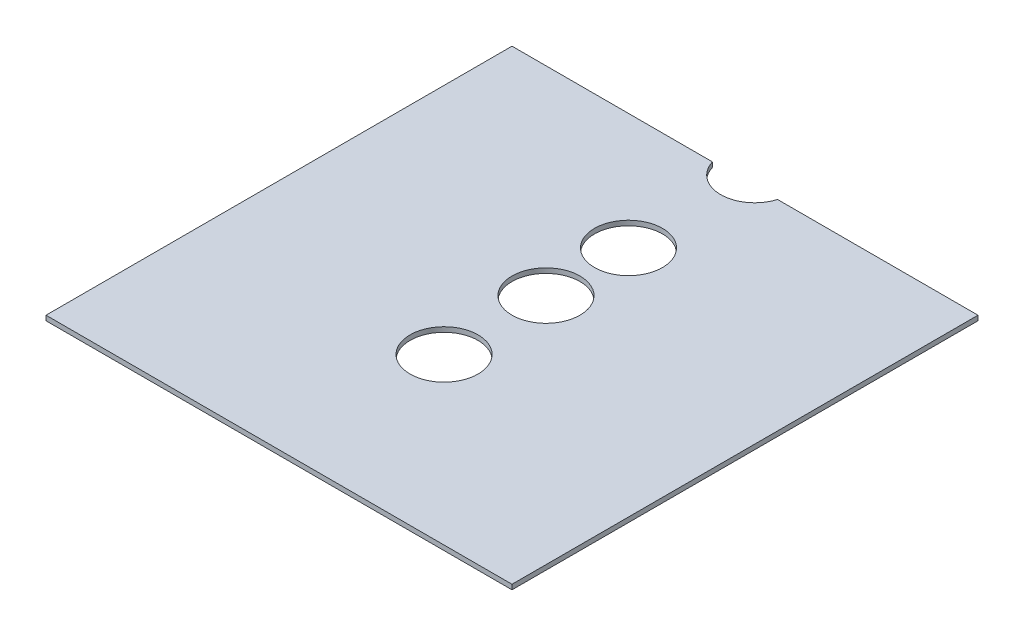
ISO-10303-21;
HEADER;
FILE_DESCRIPTION(('STEP AP214'),'2;1');
FILE_NAME('part.step','',(''),(''),'','','');
FILE_SCHEMA(('AUTOMOTIVE_DESIGN { 1 0 10303 214 1 1 1 1 }'));
ENDSEC;
DATA;
#1=APPLICATION_CONTEXT('core data for automotive mechanical design processes');
#2=APPLICATION_PROTOCOL_DEFINITION('international standard','automotive_design',2000,#1);
#3=PRODUCT_CONTEXT('',#1,'mechanical');
#4=PRODUCT('Part','Part','',(#3));
#5=PRODUCT_RELATED_PRODUCT_CATEGORY('part','',(#4));
#6=PRODUCT_DEFINITION_FORMATION('','',#4);
#7=PRODUCT_DEFINITION_CONTEXT('part definition',#1,'design');
#8=PRODUCT_DEFINITION('design','',#6,#7);
#9=PRODUCT_DEFINITION_SHAPE('','',#8);
#10=(LENGTH_UNIT() NAMED_UNIT(*) SI_UNIT(.MILLI.,.METRE.));
#11=(NAMED_UNIT(*) PLANE_ANGLE_UNIT() SI_UNIT($,.RADIAN.));
#12=(NAMED_UNIT(*) SI_UNIT($,.STERADIAN.) SOLID_ANGLE_UNIT());
#13=UNCERTAINTY_MEASURE_WITH_UNIT(LENGTH_MEASURE(1.E-05),#10,'distance_accuracy_value','');
#14=(GEOMETRIC_REPRESENTATION_CONTEXT(3) GLOBAL_UNCERTAINTY_ASSIGNED_CONTEXT((#13)) GLOBAL_UNIT_ASSIGNED_CONTEXT((#10,
#11,#12)) REPRESENTATION_CONTEXT('',''));
#15=CARTESIAN_POINT('',(0.,0.,0.));
#16=DIRECTION('',(0.,0.,1.));
#17=DIRECTION('',(1.,0.,0.));
#18=AXIS2_PLACEMENT_3D('',#15,#16,#17);
#19=CARTESIAN_POINT('',(-387.157575757576,6.35,-281.709090909091));
#20=DIRECTION('',(0.,0.,1.));
#21=DIRECTION('',(1.,0.,0.));
#22=AXIS2_PLACEMENT_3D('',#19,#20,#21);
#23=PLANE('',#22);
#24=DIRECTION('',(-1.,0.,0.));
#25=VECTOR('',#24,1.);
#26=CARTESIAN_POINT('',(-387.157575757576,0.,-281.709090909091));
#27=LINE('',#26,#25);
#28=CARTESIAN_POINT('',(222.442424242424,0.,-281.709090909091));
#29=VERTEX_POINT('',#28);
#30=CARTESIAN_POINT('',(-39.7604807862043,0.,-281.709090909091));
#31=VERTEX_POINT('',#30);
#32=EDGE_CURVE('E111',#29,#31,#27,.T.);
#33=ORIENTED_EDGE('',*,*,#32,.T.);
#34=DIRECTION('',(0.,1.,0.));
#35=VECTOR('',#34,1.);
#36=CARTESIAN_POINT('',(-39.7604807862043,-95.25,-281.709090909091));
#37=LINE('',#36,#35);
#38=CARTESIAN_POINT('',(-39.7604807862043,6.35,-281.709090909091));
#39=VERTEX_POINT('',#38);
#40=EDGE_CURVE('E54',#31,#39,#37,.T.);
#41=ORIENTED_EDGE('',*,*,#40,.T.);
#42=DIRECTION('',(-1.,0.,0.));
#43=VECTOR('',#42,1.);
#44=CARTESIAN_POINT('',(-387.157575757576,6.35,-281.709090909091));
#45=LINE('',#44,#43);
#46=CARTESIAN_POINT('',(222.442424242424,6.35,-281.709090909091));
#47=VERTEX_POINT('',#46);
#48=EDGE_CURVE('E109',#47,#39,#45,.T.);
#49=ORIENTED_EDGE('',*,*,#48,.F.);
#50=DIRECTION('',(0.,-1.,0.));
#51=VECTOR('',#50,1.);
#52=CARTESIAN_POINT('',(222.442424242424,6.35,-281.709090909091));
#53=LINE('',#52,#51);
#54=EDGE_CURVE('E121',#47,#29,#53,.T.);
#55=ORIENTED_EDGE('',*,*,#54,.T.);
#56=EDGE_LOOP('',(#33,#41,#49,#55));
#57=FACE_BOUND('',#56,.T.);
#58=ADVANCED_FACE('F39',(#57),#23,.F.);
#59=CARTESIAN_POINT('',(-387.157575757576,6.35,-281.709090909091));
#60=DIRECTION('',(1.,0.,0.));
#61=DIRECTION('',(0.,0.,-1.));
#62=AXIS2_PLACEMENT_3D('',#59,#60,#61);
#63=PLANE('',#62);
#64=DIRECTION('',(0.,0.,1.));
#65=VECTOR('',#64,1.);
#66=CARTESIAN_POINT('',(-387.157575757576,0.,-281.709090909091));
#67=LINE('',#66,#65);
#68=CARTESIAN_POINT('',(-387.157575757576,0.,-281.709090909091));
#69=VERTEX_POINT('',#68);
#70=CARTESIAN_POINT('',(-387.157575757576,0.,327.890909090909));
#71=VERTEX_POINT('',#70);
#72=EDGE_CURVE('E112',#69,#71,#67,.T.);
#73=ORIENTED_EDGE('',*,*,#72,.T.);
#74=DIRECTION('',(0.,-1.,0.));
#75=VECTOR('',#74,1.);
#76=CARTESIAN_POINT('',(-387.157575757576,6.35,327.890909090909));
#77=LINE('',#76,#75);
#78=CARTESIAN_POINT('',(-387.157575757576,6.35,327.890909090909));
#79=VERTEX_POINT('',#78);
#80=EDGE_CURVE('E47',#79,#71,#77,.T.);
#81=ORIENTED_EDGE('',*,*,#80,.F.);
#82=DIRECTION('',(0.,0.,1.));
#83=VECTOR('',#82,1.);
#84=CARTESIAN_POINT('',(-387.157575757576,6.35,-281.709090909091));
#85=LINE('',#84,#83);
#86=CARTESIAN_POINT('',(-387.157575757576,6.35,-281.709090909091));
#87=VERTEX_POINT('',#86);
#88=EDGE_CURVE('E132',#87,#79,#85,.T.);
#89=ORIENTED_EDGE('',*,*,#88,.F.);
#90=DIRECTION('',(0.,-1.,0.));
#91=VECTOR('',#90,1.);
#92=CARTESIAN_POINT('',(-387.157575757576,6.35,-281.709090909091));
#93=LINE('',#92,#91);
#94=EDGE_CURVE('E119',#87,#69,#93,.T.);
#95=ORIENTED_EDGE('',*,*,#94,.T.);
#96=EDGE_LOOP('',(#73,#81,#89,#95));
#97=FACE_BOUND('',#96,.T.);
#98=ADVANCED_FACE('F41',(#97),#63,.F.);
#99=CARTESIAN_POINT('',(-387.157575757576,6.35,327.890909090909));
#100=DIRECTION('',(0.,0.,-1.));
#101=DIRECTION('',(-1.,0.,0.));
#102=AXIS2_PLACEMENT_3D('',#99,#100,#101);
#103=PLANE('',#102);
#104=DIRECTION('',(1.,0.,0.));
#105=VECTOR('',#104,1.);
#106=CARTESIAN_POINT('',(-387.157575757576,0.,327.890909090909));
#107=LINE('',#106,#105);
#108=CARTESIAN_POINT('',(222.442424242424,0.,327.890909090909));
#109=VERTEX_POINT('',#108);
#110=EDGE_CURVE('E128',#71,#109,#107,.T.);
#111=ORIENTED_EDGE('',*,*,#110,.T.);
#112=DIRECTION('',(0.,-1.,0.));
#113=VECTOR('',#112,1.);
#114=CARTESIAN_POINT('',(222.442424242424,6.35,327.890909090909));
#115=LINE('',#114,#113);
#116=CARTESIAN_POINT('',(222.442424242424,6.35,327.890909090909));
#117=VERTEX_POINT('',#116);
#118=EDGE_CURVE('E135',#117,#109,#115,.T.);
#119=ORIENTED_EDGE('',*,*,#118,.F.);
#120=DIRECTION('',(1.,0.,0.));
#121=VECTOR('',#120,1.);
#122=CARTESIAN_POINT('',(-387.157575757576,6.35,327.890909090909));
#123=LINE('',#122,#121);
#124=EDGE_CURVE('E92',#79,#117,#123,.T.);
#125=ORIENTED_EDGE('',*,*,#124,.F.);
#126=ORIENTED_EDGE('',*,*,#80,.T.);
#127=EDGE_LOOP('',(#111,#119,#125,#126));
#128=FACE_BOUND('',#127,.T.);
#129=ADVANCED_FACE('F154',(#128),#103,.F.);
#130=CARTESIAN_POINT('',(222.442424242424,6.35,-281.709090909091));
#131=DIRECTION('',(-1.,0.,0.));
#132=DIRECTION('',(0.,0.,1.));
#133=AXIS2_PLACEMENT_3D('',#130,#131,#132);
#134=PLANE('',#133);
#135=DIRECTION('',(0.,0.,-1.));
#136=VECTOR('',#135,1.);
#137=CARTESIAN_POINT('',(222.442424242424,0.,-281.709090909091));
#138=LINE('',#137,#136);
#139=EDGE_CURVE('E130',#109,#29,#138,.T.);
#140=ORIENTED_EDGE('',*,*,#139,.T.);
#141=ORIENTED_EDGE('',*,*,#54,.F.);
#142=DIRECTION('',(0.,0.,-1.));
#143=VECTOR('',#142,1.);
#144=CARTESIAN_POINT('',(222.442424242424,6.35,-281.709090909091));
#145=LINE('',#144,#143);
#146=EDGE_CURVE('E117',#117,#47,#145,.T.);
#147=ORIENTED_EDGE('',*,*,#146,.F.);
#148=ORIENTED_EDGE('',*,*,#118,.T.);
#149=EDGE_LOOP('',(#140,#141,#147,#148));
#150=FACE_BOUND('',#149,.T.);
#151=ADVANCED_FACE('F157',(#150),#134,.F.);
#152=CARTESIAN_POINT('',(-124.954670728947,6.35,-281.709090909091));
#153=VERTEX_POINT('',#152);
#154=EDGE_CURVE('E62',#153,#87,#45,.T.);
#155=ORIENTED_EDGE('',*,*,#154,.F.);
#156=DIRECTION('',(0.,1.,0.));
#157=VECTOR('',#156,1.);
#158=CARTESIAN_POINT('',(-124.954670728947,-95.25,-281.709090909091));
#159=LINE('',#158,#157);
#160=CARTESIAN_POINT('',(-124.954670728947,0.,-281.709090909091));
#161=VERTEX_POINT('',#160);
#162=EDGE_CURVE('E101',#153,#161,#159,.F.);
#163=ORIENTED_EDGE('',*,*,#162,.T.);
#164=EDGE_CURVE('E84',#161,#69,#27,.T.);
#165=ORIENTED_EDGE('',*,*,#164,.T.);
#166=ORIENTED_EDGE('',*,*,#94,.F.);
#167=EDGE_LOOP('',(#155,#163,#165,#166));
#168=FACE_BOUND('',#167,.T.);
#169=ADVANCED_FACE('F162',(#168),#23,.F.);
#170=CARTESIAN_POINT('',(0.,6.35,0.));
#171=DIRECTION('',(0.,1.,0.));
#172=DIRECTION('',(0.,0.,1.));
#173=AXIS2_PLACEMENT_3D('',#170,#171,#172);
#174=PLANE('',#173);
#175=CARTESIAN_POINT('',(-82.3575757575758,6.35,-294.409090909091));
#176=DIRECTION('',(0.,1.,0.));
#177=DIRECTION('',(0.,0.,1.));
#178=AXIS2_PLACEMENT_3D('',#175,#176,#177);
#179=CIRCLE('',#178,44.4500000000004);
#180=EDGE_CURVE('E99',#153,#39,#179,.T.);
#181=ORIENTED_EDGE('',*,*,#180,.F.);
#182=ORIENTED_EDGE('',*,*,#154,.T.);
#183=ORIENTED_EDGE('',*,*,#88,.T.);
#184=ORIENTED_EDGE('',*,*,#124,.T.);
#185=ORIENTED_EDGE('',*,*,#146,.T.);
#186=ORIENTED_EDGE('',*,*,#48,.T.);
#187=EDGE_LOOP('',(#181,#182,#183,#184,#185,#186));
#188=FACE_BOUND('',#187,.T.);
#189=CARTESIAN_POINT('',(-82.3575757575756,6.35,111.990909090909));
#190=DIRECTION('',(0.,1.,0.));
#191=DIRECTION('',(0.,0.,1.));
#192=AXIS2_PLACEMENT_3D('',#189,#190,#191);
#193=CIRCLE('',#192,44.4499999999999);
#194=CARTESIAN_POINT('',(-82.3575757575756,6.35,156.440909090909));
#195=VERTEX_POINT('',#194);
#196=EDGE_CURVE('E103',#195,#195,#193,.T.);
#197=ORIENTED_EDGE('',*,*,#196,.F.);
#198=EDGE_LOOP('',(#197));
#199=FACE_BOUND('',#198,.T.);
#200=CARTESIAN_POINT('',(-82.3575757575757,6.35,-21.3590909090906));
#201=DIRECTION('',(0.,1.,0.));
#202=DIRECTION('',(0.,0.,1.));
#203=AXIS2_PLACEMENT_3D('',#200,#201,#202);
#204=CIRCLE('',#203,44.4499999999999);
#205=CARTESIAN_POINT('',(-82.3575757575757,6.35,23.0909090909093));
#206=VERTEX_POINT('',#205);
#207=EDGE_CURVE('E249',#206,#206,#204,.T.);
#208=ORIENTED_EDGE('',*,*,#207,.F.);
#209=EDGE_LOOP('',(#208));
#210=FACE_BOUND('',#209,.T.);
#211=CARTESIAN_POINT('',(-82.3575757575757,6.35,-129.309090909091));
#212=DIRECTION('',(0.,1.,0.));
#213=DIRECTION('',(0.,0.,1.));
#214=AXIS2_PLACEMENT_3D('',#211,#212,#213);
#215=CIRCLE('',#214,44.45);
#216=CARTESIAN_POINT('',(-82.3575757575757,6.35,-84.8590909090909));
#217=VERTEX_POINT('',#216);
#218=EDGE_CURVE('E143',#217,#217,#215,.T.);
#219=ORIENTED_EDGE('',*,*,#218,.F.);
#220=EDGE_LOOP('',(#219));
#221=FACE_BOUND('',#220,.T.);
#222=ADVANCED_FACE('F114',(#188,#199,#210,#221),#174,.T.);
#223=CARTESIAN_POINT('',(0.,0.,0.));
#224=DIRECTION('',(0.,1.,0.));
#225=DIRECTION('',(0.,0.,1.));
#226=AXIS2_PLACEMENT_3D('',#223,#224,#225);
#227=PLANE('',#226);
#228=CARTESIAN_POINT('',(-82.3575757575756,0.,111.990909090909));
#229=DIRECTION('',(0.,1.,0.));
#230=DIRECTION('',(0.,0.,1.));
#231=AXIS2_PLACEMENT_3D('',#228,#229,#230);
#232=CIRCLE('',#231,44.4499999999999);
#233=CARTESIAN_POINT('',(-82.3575757575756,0.,156.440909090909));
#234=VERTEX_POINT('',#233);
#235=EDGE_CURVE('E145',#234,#234,#232,.T.);
#236=ORIENTED_EDGE('',*,*,#235,.T.);
#237=EDGE_LOOP('',(#236));
#238=FACE_BOUND('',#237,.T.);
#239=CARTESIAN_POINT('',(-82.3575757575757,0.,-21.3590909090906));
#240=DIRECTION('',(0.,1.,0.));
#241=DIRECTION('',(0.,0.,1.));
#242=AXIS2_PLACEMENT_3D('',#239,#240,#241);
#243=CIRCLE('',#242,44.4499999999999);
#244=CARTESIAN_POINT('',(-82.3575757575757,0.,23.0909090909093));
#245=VERTEX_POINT('',#244);
#246=EDGE_CURVE('E142',#245,#245,#243,.T.);
#247=ORIENTED_EDGE('',*,*,#246,.T.);
#248=EDGE_LOOP('',(#247));
#249=FACE_BOUND('',#248,.T.);
#250=CARTESIAN_POINT('',(-82.3575757575757,0.,-129.309090909091));
#251=DIRECTION('',(0.,1.,0.));
#252=DIRECTION('',(0.,0.,1.));
#253=AXIS2_PLACEMENT_3D('',#250,#251,#252);
#254=CIRCLE('',#253,44.45);
#255=CARTESIAN_POINT('',(-82.3575757575757,0.,-84.8590909090909));
#256=VERTEX_POINT('',#255);
#257=EDGE_CURVE('E139',#256,#256,#254,.T.);
#258=ORIENTED_EDGE('',*,*,#257,.T.);
#259=EDGE_LOOP('',(#258));
#260=FACE_BOUND('',#259,.T.);
#261=ORIENTED_EDGE('',*,*,#164,.F.);
#262=CARTESIAN_POINT('',(-82.3575757575758,0.,-294.409090909091));
#263=DIRECTION('',(0.,1.,0.));
#264=DIRECTION('',(0.,0.,1.));
#265=AXIS2_PLACEMENT_3D('',#262,#263,#264);
#266=CIRCLE('',#265,44.4500000000004);
#267=EDGE_CURVE('E11',#161,#31,#266,.T.);
#268=ORIENTED_EDGE('',*,*,#267,.T.);
#269=ORIENTED_EDGE('',*,*,#32,.F.);
#270=ORIENTED_EDGE('',*,*,#139,.F.);
#271=ORIENTED_EDGE('',*,*,#110,.F.);
#272=ORIENTED_EDGE('',*,*,#72,.F.);
#273=EDGE_LOOP('',(#261,#268,#269,#270,#271,#272));
#274=FACE_BOUND('',#273,.T.);
#275=ADVANCED_FACE('F159',(#238,#249,#260,#274),#227,.F.);
#276=CARTESIAN_POINT('',(-82.3575757575757,-95.25,-129.309090909091));
#277=DIRECTION('',(0.,1.,0.));
#278=DIRECTION('',(0.,0.,1.));
#279=AXIS2_PLACEMENT_3D('',#276,#277,#278);
#280=CYLINDRICAL_SURFACE('',#279,44.45);
#281=ORIENTED_EDGE('',*,*,#218,.T.);
#282=EDGE_LOOP('',(#281));
#283=FACE_BOUND('',#282,.T.);
#284=ORIENTED_EDGE('',*,*,#257,.F.);
#285=EDGE_LOOP('',(#284));
#286=FACE_BOUND('',#285,.T.);
#287=ADVANCED_FACE('F202',(#283,#286),#280,.F.);
#288=CARTESIAN_POINT('',(-82.3575757575757,-95.25,-21.3590909090906));
#289=DIRECTION('',(0.,1.,0.));
#290=DIRECTION('',(0.,0.,1.));
#291=AXIS2_PLACEMENT_3D('',#288,#289,#290);
#292=CYLINDRICAL_SURFACE('',#291,44.4499999999999);
#293=ORIENTED_EDGE('',*,*,#207,.T.);
#294=EDGE_LOOP('',(#293));
#295=FACE_BOUND('',#294,.T.);
#296=ORIENTED_EDGE('',*,*,#246,.F.);
#297=EDGE_LOOP('',(#296));
#298=FACE_BOUND('',#297,.T.);
#299=ADVANCED_FACE('F214',(#295,#298),#292,.F.);
#300=CARTESIAN_POINT('',(-82.3575757575756,-95.25,111.990909090909));
#301=DIRECTION('',(0.,1.,0.));
#302=DIRECTION('',(0.,0.,1.));
#303=AXIS2_PLACEMENT_3D('',#300,#301,#302);
#304=CYLINDRICAL_SURFACE('',#303,44.4499999999999);
#305=ORIENTED_EDGE('',*,*,#196,.T.);
#306=EDGE_LOOP('',(#305));
#307=FACE_BOUND('',#306,.T.);
#308=ORIENTED_EDGE('',*,*,#235,.F.);
#309=EDGE_LOOP('',(#308));
#310=FACE_BOUND('',#309,.T.);
#311=ADVANCED_FACE('F221',(#307,#310),#304,.F.);
#312=CARTESIAN_POINT('',(-82.3575757575758,-95.25,-294.409090909091));
#313=DIRECTION('',(0.,1.,0.));
#314=DIRECTION('',(0.,0.,1.));
#315=AXIS2_PLACEMENT_3D('',#312,#313,#314);
#316=CYLINDRICAL_SURFACE('',#315,44.4500000000004);
#317=ORIENTED_EDGE('',*,*,#267,.F.);
#318=ORIENTED_EDGE('',*,*,#162,.F.);
#319=ORIENTED_EDGE('',*,*,#180,.T.);
#320=ORIENTED_EDGE('',*,*,#40,.F.);
#321=EDGE_LOOP('',(#317,#318,#319,#320));
#322=FACE_BOUND('',#321,.T.);
#323=ADVANCED_FACE('F100',(#322),#316,.F.);
#324=CLOSED_SHELL('',(#58,#98,#129,#151,#169,#222,#275,#287,#299,#311,#323));
#325=MANIFOLD_SOLID_BREP('B2',#324);
#326=ADVANCED_BREP_SHAPE_REPRESENTATION('',(#18,#325),#14);
#327=SHAPE_DEFINITION_REPRESENTATION(#9,#326);
ENDSEC;
END-ISO-10303-21;
